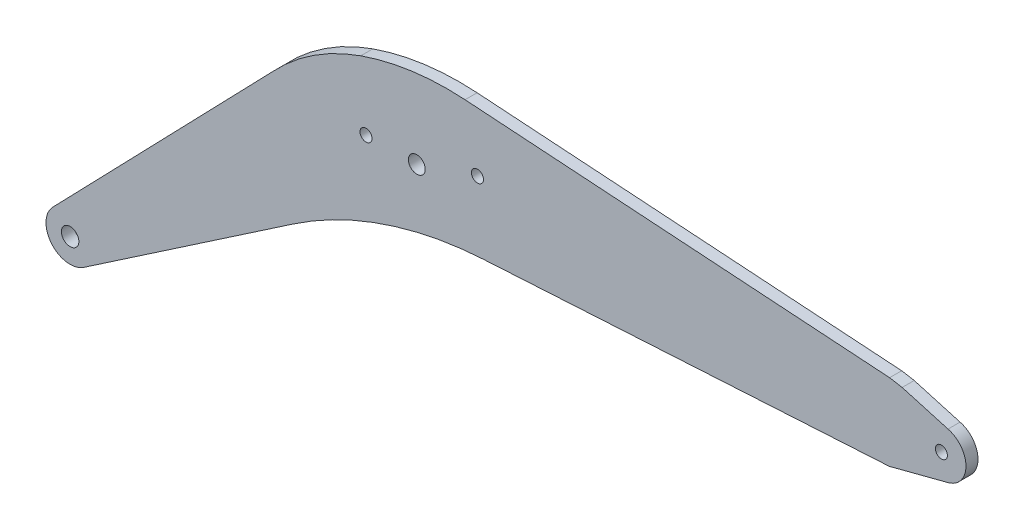
ISO-10303-21;
HEADER;
FILE_DESCRIPTION(('STEP AP214'),'2;1');
FILE_NAME('part.step','',(''),(''),'','','');
FILE_SCHEMA(('AUTOMOTIVE_DESIGN { 1 0 10303 214 1 1 1 1 }'));
ENDSEC;
DATA;
#1=APPLICATION_CONTEXT('core data for automotive mechanical design processes');
#2=APPLICATION_PROTOCOL_DEFINITION('international standard','automotive_design',2000,#1);
#3=PRODUCT_CONTEXT('',#1,'mechanical');
#4=PRODUCT('Part','Part','',(#3));
#5=PRODUCT_RELATED_PRODUCT_CATEGORY('part','',(#4));
#6=PRODUCT_DEFINITION_FORMATION('','',#4);
#7=PRODUCT_DEFINITION_CONTEXT('part definition',#1,'design');
#8=PRODUCT_DEFINITION('design','',#6,#7);
#9=PRODUCT_DEFINITION_SHAPE('','',#8);
#10=(LENGTH_UNIT() NAMED_UNIT(*) SI_UNIT(.MILLI.,.METRE.));
#11=(NAMED_UNIT(*) PLANE_ANGLE_UNIT() SI_UNIT($,.RADIAN.));
#12=(NAMED_UNIT(*) SI_UNIT($,.STERADIAN.) SOLID_ANGLE_UNIT());
#13=UNCERTAINTY_MEASURE_WITH_UNIT(LENGTH_MEASURE(1.E-05),#10,'distance_accuracy_value','');
#14=(GEOMETRIC_REPRESENTATION_CONTEXT(3) GLOBAL_UNCERTAINTY_ASSIGNED_CONTEXT((#13)) GLOBAL_UNIT_ASSIGNED_CONTEXT((#10,
#11,#12)) REPRESENTATION_CONTEXT('',''));
#15=CARTESIAN_POINT('',(0.,0.,0.));
#16=DIRECTION('',(0.,0.,1.));
#17=DIRECTION('',(1.,0.,0.));
#18=AXIS2_PLACEMENT_3D('',#15,#16,#17);
#19=CARTESIAN_POINT('',(-131.545238804572,15.2564723501261,3.));
#20=DIRECTION('',(0.,0.,1.));
#21=DIRECTION('',(1.,0.,0.));
#22=AXIS2_PLACEMENT_3D('',#19,#20,#21);
#23=PLANE('',#22);
#24=CARTESIAN_POINT('',(-57.9271369786803,73.9111813109327,3.));
#25=DIRECTION('',(0.,0.,1.));
#26=DIRECTION('',(1.,0.,0.));
#27=AXIS2_PLACEMENT_3D('',#24,#25,#26);
#28=CIRCLE('',#27,1.5);
#29=CARTESIAN_POINT('',(-56.4271369786803,73.9111813109327,3.));
#30=VERTEX_POINT('',#29);
#31=EDGE_CURVE('E301',#30,#30,#28,.T.);
#32=ORIENTED_EDGE('',*,*,#31,.F.);
#33=EDGE_LOOP('',(#32));
#34=FACE_BOUND('',#33,.T.);
#35=CARTESIAN_POINT('',(-131.545238804572,15.2564723501261,3.));
#36=DIRECTION('',(0.,0.,1.));
#37=DIRECTION('',(1.,0.,0.));
#38=AXIS2_PLACEMENT_3D('',#35,#36,#37);
#39=CIRCLE('',#38,2.175);
#40=CARTESIAN_POINT('',(-129.370238804572,15.2564723501261,3.));
#41=VERTEX_POINT('',#40);
#42=EDGE_CURVE('E314',#41,#41,#39,.T.);
#43=ORIENTED_EDGE('',*,*,#42,.F.);
#44=EDGE_LOOP('',(#43));
#45=FACE_BOUND('',#44,.T.);
#46=CARTESIAN_POINT('',(-131.545238804572,15.2564723501261,3.));
#47=DIRECTION('',(0.,0.,1.));
#48=DIRECTION('',(1.,0.,0.));
#49=AXIS2_PLACEMENT_3D('',#46,#47,#48);
#50=CIRCLE('',#49,6.00000000000002);
#51=CARTESIAN_POINT('',(-135.858404880973,19.4273953172143,3.));
#52=VERTEX_POINT('',#51);
#53=CARTESIAN_POINT('',(-128.173606682712,10.2933990245699,3.));
#54=VERTEX_POINT('',#53);
#55=EDGE_CURVE('E181',#52,#54,#50,.T.);
#56=ORIENTED_EDGE('',*,*,#55,.T.);
#57=DIRECTION('',(0.827178887592696,0.561938686976534,0.));
#58=VECTOR('',#57,1.);
#59=CARTESIAN_POINT('',(-128.173606682712,10.2933990245699,3.));
#60=LINE('',#59,#58);
#61=CARTESIAN_POINT('',(-76.0452388045716,45.7064723501261,3.));
#62=VERTEX_POINT('',#61);
#63=EDGE_CURVE('E112',#54,#62,#60,.T.);
#64=ORIENTED_EDGE('',*,*,#63,.T.);
#65=CARTESIAN_POINT('',(-23.341668011505,-31.873665965911,3.));
#66=DIRECTION('',(0.,0.,-1.));
#67=DIRECTION('',(-1.,0.,0.));
#68=AXIS2_PLACEMENT_3D('',#65,#66,#67);
#69=CIRCLE('',#68,93.7888278819776);
#70=CARTESIAN_POINT('',(-28.7952388045717,61.7564723501261,3.));
#71=VERTEX_POINT('',#70);
#72=EDGE_CURVE('E208',#62,#71,#69,.T.);
#73=ORIENTED_EDGE('',*,*,#72,.T.);
#74=DIRECTION('',(0.998308012057255,0.0581473392537677,0.));
#75=VECTOR('',#74,1.);
#76=CARTESIAN_POINT('',(-28.7952388045717,61.7564723501261,3.));
#77=LINE('',#76,#75);
#78=CARTESIAN_POINT('',(72.2571826827686,67.6423606367785,3.));
#79=VERTEX_POINT('',#78);
#80=EDGE_CURVE('E229',#71,#79,#77,.T.);
#81=ORIENTED_EDGE('',*,*,#80,.T.);
#82=DIRECTION('',(0.967821760115837,0.251636723564514,0.));
#83=VECTOR('',#82,1.);
#84=CARTESIAN_POINT('',(72.2571826827686,67.6423606367785,3.));
#85=LINE('',#84,#83);
#86=CARTESIAN_POINT('',(86.8536152517564,71.4374793443294,3.));
#87=VERTEX_POINT('',#86);
#88=EDGE_CURVE('E227',#79,#87,#85,.T.);
#89=ORIENTED_EDGE('',*,*,#88,.T.);
#90=CARTESIAN_POINT('',(85.3536587948242,77.2064723501261,3.));
#91=DIRECTION('',(0.,0.,1.));
#92=DIRECTION('',(1.,0.,0.));
#93=AXIS2_PLACEMENT_3D('',#90,#91,#92);
#94=CIRCLE('',#93,5.96080109327794);
#95=CARTESIAN_POINT('',(86.8536152517564,82.9754653559228,3.));
#96=VERTEX_POINT('',#95);
#97=EDGE_CURVE('E228',#87,#96,#94,.T.);
#98=ORIENTED_EDGE('',*,*,#97,.T.);
#99=DIRECTION('',(-0.961498834299442,0.274809009388,0.));
#100=VECTOR('',#99,1.);
#101=CARTESIAN_POINT('',(86.8536152517564,82.9754653559228,3.));
#102=LINE('',#101,#100);
#103=CARTESIAN_POINT('',(75.443530199253,86.2366176927282,3.));
#104=VERTEX_POINT('',#103);
#105=EDGE_CURVE('E233',#96,#104,#102,.T.);
#106=ORIENTED_EDGE('',*,*,#105,.T.);
#107=DIRECTION('',(-0.985134231864256,0.171786335921171,0.));
#108=VECTOR('',#107,1.);
#109=CARTESIAN_POINT('',(75.443530199253,86.2366176927282,3.));
#110=LINE('',#109,#108);
#111=CARTESIAN_POINT('',(72.3240612596195,86.7805863437265,3.));
#112=VERTEX_POINT('',#111);
#113=EDGE_CURVE('E240',#104,#112,#110,.T.);
#114=ORIENTED_EDGE('',*,*,#113,.T.);
#115=DIRECTION('',(-0.997763411032669,0.0668444134124417,0.));
#116=VECTOR('',#115,1.);
#117=CARTESIAN_POINT('',(72.3240612596195,86.7805863437265,3.));
#118=LINE('',#117,#116);
#119=CARTESIAN_POINT('',(-33.2952388045717,93.8564723501261,3.));
#120=VERTEX_POINT('',#119);
#121=EDGE_CURVE('E145',#112,#120,#118,.T.);
#122=ORIENTED_EDGE('',*,*,#121,.T.);
#123=CARTESIAN_POINT('',(-37.6697013598195,28.5603846482576,3.));
#124=DIRECTION('',(0.,0.,1.));
#125=DIRECTION('',(1.,0.,0.));
#126=AXIS2_PLACEMENT_3D('',#123,#124,#125);
#127=CIRCLE('',#126,65.4424555760048);
#128=CARTESIAN_POINT('',(-59.2400023293627,90.3457964207844,3.));
#129=VERTEX_POINT('',#128);
#130=EDGE_CURVE('E138',#120,#129,#127,.T.);
#131=ORIENTED_EDGE('',*,*,#130,.T.);
#132=CARTESIAN_POINT('',(-41.3597511826686,39.1300678477543,3.));
#133=DIRECTION('',(0.,0.,1.));
#134=DIRECTION('',(1.,0.,0.));
#135=AXIS2_PLACEMENT_3D('',#132,#133,#134);
#136=CIRCLE('',#135,54.2471587673967);
#137=CARTESIAN_POINT('',(-81.1452388045716,76.0064723501261,3.));
#138=VERTEX_POINT('',#137);
#139=EDGE_CURVE('E137',#129,#138,#136,.T.);
#140=ORIENTED_EDGE('',*,*,#139,.T.);
#141=DIRECTION('',(-0.695153827848035,-0.718861012733494,0.));
#142=VECTOR('',#141,1.);
#143=CARTESIAN_POINT('',(-81.1452388045716,76.0064723501261,3.));
#144=LINE('',#143,#142);
#145=EDGE_CURVE('E57',#138,#52,#144,.T.);
#146=ORIENTED_EDGE('',*,*,#145,.T.);
#147=EDGE_LOOP('',(#56,#64,#73,#81,#89,#98,#106,#114,#122,#131,#140,#146));
#148=FACE_BOUND('',#147,.T.);
#149=CARTESIAN_POINT('',(85.2047611954284,77.2064723501261,3.));
#150=DIRECTION('',(0.,0.,1.));
#151=DIRECTION('',(1.,0.,0.));
#152=AXIS2_PLACEMENT_3D('',#149,#150,#151);
#153=CIRCLE('',#152,1.5);
#154=CARTESIAN_POINT('',(86.7047611954284,77.2064723501261,3.));
#155=VERTEX_POINT('',#154);
#156=EDGE_CURVE('E161',#155,#155,#153,.T.);
#157=ORIENTED_EDGE('',*,*,#156,.F.);
#158=EDGE_LOOP('',(#157));
#159=FACE_BOUND('',#158,.T.);
#160=CARTESIAN_POINT('',(-45.2952388045717,73.9111813109327,3.));
#161=DIRECTION('',(0.,0.,1.));
#162=DIRECTION('',(1.,0.,0.));
#163=AXIS2_PLACEMENT_3D('',#160,#161,#162);
#164=CIRCLE('',#163,2.1);
#165=CARTESIAN_POINT('',(-43.1952388045717,73.9111813109327,3.));
#166=VERTEX_POINT('',#165);
#167=EDGE_CURVE('E310',#166,#166,#164,.T.);
#168=ORIENTED_EDGE('',*,*,#167,.F.);
#169=EDGE_LOOP('',(#168));
#170=FACE_BOUND('',#169,.T.);
#171=CARTESIAN_POINT('',(-30.210957336747,78.946585735948,3.));
#172=DIRECTION('',(0.,0.,1.));
#173=DIRECTION('',(1.,0.,0.));
#174=AXIS2_PLACEMENT_3D('',#171,#172,#173);
#175=CIRCLE('',#174,1.5);
#176=CARTESIAN_POINT('',(-28.710957336747,78.946585735948,3.));
#177=VERTEX_POINT('',#176);
#178=EDGE_CURVE('E295',#177,#177,#175,.T.);
#179=ORIENTED_EDGE('',*,*,#178,.F.);
#180=EDGE_LOOP('',(#179));
#181=FACE_BOUND('',#180,.T.);
#182=ADVANCED_FACE('F39',(#34,#45,#148,#159,#170,#181),#23,.T.);
#183=CARTESIAN_POINT('',(-131.545238804572,15.2564723501261,0.));
#184=DIRECTION('',(0.,0.,1.));
#185=DIRECTION('',(1.,0.,0.));
#186=AXIS2_PLACEMENT_3D('',#183,#184,#185);
#187=PLANE('',#186);
#188=CARTESIAN_POINT('',(-131.545238804572,15.2564723501261,0.));
#189=DIRECTION('',(0.,0.,1.));
#190=DIRECTION('',(1.,0.,0.));
#191=AXIS2_PLACEMENT_3D('',#188,#189,#190);
#192=CIRCLE('',#191,6.00000000000002);
#193=CARTESIAN_POINT('',(-135.858404880973,19.4273953172143,0.));
#194=VERTEX_POINT('',#193);
#195=CARTESIAN_POINT('',(-128.173606682712,10.2933990245699,0.));
#196=VERTEX_POINT('',#195);
#197=EDGE_CURVE('E158',#194,#196,#192,.T.);
#198=ORIENTED_EDGE('',*,*,#197,.F.);
#199=DIRECTION('',(-0.695153827848035,-0.718861012733494,0.));
#200=VECTOR('',#199,1.);
#201=CARTESIAN_POINT('',(-81.1452388045716,76.0064723501261,0.));
#202=LINE('',#201,#200);
#203=CARTESIAN_POINT('',(-81.1452388045716,76.0064723501261,0.));
#204=VERTEX_POINT('',#203);
#205=EDGE_CURVE('E102',#204,#194,#202,.T.);
#206=ORIENTED_EDGE('',*,*,#205,.F.);
#207=CARTESIAN_POINT('',(-41.3597511826686,39.1300678477543,0.));
#208=DIRECTION('',(0.,0.,1.));
#209=DIRECTION('',(1.,0.,0.));
#210=AXIS2_PLACEMENT_3D('',#207,#208,#209);
#211=CIRCLE('',#210,54.2471587673967);
#212=CARTESIAN_POINT('',(-59.2400023293627,90.3457964207844,0.));
#213=VERTEX_POINT('',#212);
#214=EDGE_CURVE('E100',#213,#204,#211,.T.);
#215=ORIENTED_EDGE('',*,*,#214,.F.);
#216=CARTESIAN_POINT('',(-37.6697013598195,28.5603846482576,0.));
#217=DIRECTION('',(0.,0.,1.));
#218=DIRECTION('',(1.,0.,0.));
#219=AXIS2_PLACEMENT_3D('',#216,#217,#218);
#220=CIRCLE('',#219,65.4424555760048);
#221=CARTESIAN_POINT('',(-33.2952388045717,93.8564723501261,0.));
#222=VERTEX_POINT('',#221);
#223=EDGE_CURVE('E149',#222,#213,#220,.T.);
#224=ORIENTED_EDGE('',*,*,#223,.F.);
#225=DIRECTION('',(-0.997763411032669,0.0668444134124417,0.));
#226=VECTOR('',#225,1.);
#227=CARTESIAN_POINT('',(72.3240612596195,86.7805863437265,0.));
#228=LINE('',#227,#226);
#229=CARTESIAN_POINT('',(72.3240612596195,86.7805863437265,0.));
#230=VERTEX_POINT('',#229);
#231=EDGE_CURVE('E178',#230,#222,#228,.T.);
#232=ORIENTED_EDGE('',*,*,#231,.F.);
#233=DIRECTION('',(-0.985134231864256,0.171786335921171,0.));
#234=VECTOR('',#233,1.);
#235=CARTESIAN_POINT('',(75.443530199253,86.2366176927282,0.));
#236=LINE('',#235,#234);
#237=CARTESIAN_POINT('',(75.443530199253,86.2366176927282,0.));
#238=VERTEX_POINT('',#237);
#239=EDGE_CURVE('E177',#238,#230,#236,.T.);
#240=ORIENTED_EDGE('',*,*,#239,.F.);
#241=DIRECTION('',(-0.961498834299442,0.274809009388,0.));
#242=VECTOR('',#241,1.);
#243=CARTESIAN_POINT('',(86.8536152517564,82.9754653559228,0.));
#244=LINE('',#243,#242);
#245=CARTESIAN_POINT('',(86.8536152517564,82.9754653559228,0.));
#246=VERTEX_POINT('',#245);
#247=EDGE_CURVE('E174',#246,#238,#244,.T.);
#248=ORIENTED_EDGE('',*,*,#247,.F.);
#249=CARTESIAN_POINT('',(85.3536587948242,77.2064723501261,0.));
#250=DIRECTION('',(0.,0.,1.));
#251=DIRECTION('',(1.,0.,0.));
#252=AXIS2_PLACEMENT_3D('',#249,#250,#251);
#253=CIRCLE('',#252,5.96080109327794);
#254=CARTESIAN_POINT('',(86.8536152517564,71.4374793443294,0.));
#255=VERTEX_POINT('',#254);
#256=EDGE_CURVE('E175',#255,#246,#253,.T.);
#257=ORIENTED_EDGE('',*,*,#256,.F.);
#258=DIRECTION('',(0.967821760115837,0.251636723564514,0.));
#259=VECTOR('',#258,1.);
#260=CARTESIAN_POINT('',(72.2571826827686,67.6423606367785,0.));
#261=LINE('',#260,#259);
#262=CARTESIAN_POINT('',(72.2571826827686,67.6423606367785,0.));
#263=VERTEX_POINT('',#262);
#264=EDGE_CURVE('E169',#263,#255,#261,.T.);
#265=ORIENTED_EDGE('',*,*,#264,.F.);
#266=DIRECTION('',(0.998308012057255,0.0581473392537677,0.));
#267=VECTOR('',#266,1.);
#268=CARTESIAN_POINT('',(-28.7952388045717,61.7564723501261,0.));
#269=LINE('',#268,#267);
#270=CARTESIAN_POINT('',(-28.7952388045717,61.7564723501261,0.));
#271=VERTEX_POINT('',#270);
#272=EDGE_CURVE('E168',#271,#263,#269,.T.);
#273=ORIENTED_EDGE('',*,*,#272,.F.);
#274=CARTESIAN_POINT('',(-23.341668011505,-31.873665965911,0.));
#275=DIRECTION('',(0.,0.,-1.));
#276=DIRECTION('',(-1.,0.,0.));
#277=AXIS2_PLACEMENT_3D('',#274,#275,#276);
#278=CIRCLE('',#277,93.7888278819776);
#279=CARTESIAN_POINT('',(-76.0452388045716,45.7064723501261,0.));
#280=VERTEX_POINT('',#279);
#281=EDGE_CURVE('E166',#280,#271,#278,.T.);
#282=ORIENTED_EDGE('',*,*,#281,.F.);
#283=DIRECTION('',(0.827178887592696,0.561938686976534,0.));
#284=VECTOR('',#283,1.);
#285=CARTESIAN_POINT('',(-128.173606682712,10.2933990245699,0.));
#286=LINE('',#285,#284);
#287=EDGE_CURVE('E164',#196,#280,#286,.T.);
#288=ORIENTED_EDGE('',*,*,#287,.F.);
#289=EDGE_LOOP('',(#198,#206,#215,#224,#232,#240,#248,#257,#265,#273,#282,#288));
#290=FACE_BOUND('',#289,.T.);
#291=CARTESIAN_POINT('',(85.2047611954284,77.2064723501261,0.));
#292=DIRECTION('',(0.,0.,1.));
#293=DIRECTION('',(1.,0.,0.));
#294=AXIS2_PLACEMENT_3D('',#291,#292,#293);
#295=CIRCLE('',#294,1.5);
#296=CARTESIAN_POINT('',(86.7047611954284,77.2064723501261,0.));
#297=VERTEX_POINT('',#296);
#298=EDGE_CURVE('E316',#297,#297,#295,.T.);
#299=ORIENTED_EDGE('',*,*,#298,.T.);
#300=EDGE_LOOP('',(#299));
#301=FACE_BOUND('',#300,.T.);
#302=CARTESIAN_POINT('',(-131.545238804572,15.2564723501261,0.));
#303=DIRECTION('',(0.,0.,1.));
#304=DIRECTION('',(1.,0.,0.));
#305=AXIS2_PLACEMENT_3D('',#302,#303,#304);
#306=CIRCLE('',#305,2.175);
#307=CARTESIAN_POINT('',(-129.370238804572,15.2564723501261,0.));
#308=VERTEX_POINT('',#307);
#309=EDGE_CURVE('E308',#308,#308,#306,.T.);
#310=ORIENTED_EDGE('',*,*,#309,.T.);
#311=EDGE_LOOP('',(#310));
#312=FACE_BOUND('',#311,.T.);
#313=CARTESIAN_POINT('',(-45.2952388045717,73.9111813109327,0.));
#314=DIRECTION('',(0.,0.,1.));
#315=DIRECTION('',(1.,0.,0.));
#316=AXIS2_PLACEMENT_3D('',#313,#314,#315);
#317=CIRCLE('',#316,2.1);
#318=CARTESIAN_POINT('',(-43.1952388045717,73.9111813109327,0.));
#319=VERTEX_POINT('',#318);
#320=EDGE_CURVE('E303',#319,#319,#317,.T.);
#321=ORIENTED_EDGE('',*,*,#320,.T.);
#322=EDGE_LOOP('',(#321));
#323=FACE_BOUND('',#322,.T.);
#324=CARTESIAN_POINT('',(-57.9271369786803,73.9111813109327,0.));
#325=DIRECTION('',(0.,0.,1.));
#326=DIRECTION('',(1.,0.,0.));
#327=AXIS2_PLACEMENT_3D('',#324,#325,#326);
#328=CIRCLE('',#327,1.5);
#329=CARTESIAN_POINT('',(-56.4271369786803,73.9111813109327,0.));
#330=VERTEX_POINT('',#329);
#331=EDGE_CURVE('E298',#330,#330,#328,.T.);
#332=ORIENTED_EDGE('',*,*,#331,.T.);
#333=EDGE_LOOP('',(#332));
#334=FACE_BOUND('',#333,.T.);
#335=CARTESIAN_POINT('',(-30.210957336747,78.946585735948,0.));
#336=DIRECTION('',(0.,0.,1.));
#337=DIRECTION('',(1.,0.,0.));
#338=AXIS2_PLACEMENT_3D('',#335,#336,#337);
#339=CIRCLE('',#338,1.5);
#340=CARTESIAN_POINT('',(-28.710957336747,78.946585735948,0.));
#341=VERTEX_POINT('',#340);
#342=EDGE_CURVE('E294',#341,#341,#339,.T.);
#343=ORIENTED_EDGE('',*,*,#342,.T.);
#344=EDGE_LOOP('',(#343));
#345=FACE_BOUND('',#344,.T.);
#346=ADVANCED_FACE('F211',(#290,#301,#312,#323,#334,#345),#187,.F.);
#347=CARTESIAN_POINT('',(-131.545238804572,15.2564723501261,3.));
#348=DIRECTION('',(0.,0.,-1.));
#349=DIRECTION('',(-1.,0.,0.));
#350=AXIS2_PLACEMENT_3D('',#347,#348,#349);
#351=CYLINDRICAL_SURFACE('',#350,6.00000000000002);
#352=ORIENTED_EDGE('',*,*,#197,.T.);
#353=DIRECTION('',(0.,0.,-1.));
#354=VECTOR('',#353,1.);
#355=CARTESIAN_POINT('',(-128.173606682712,10.2933990245699,3.));
#356=LINE('',#355,#354);
#357=EDGE_CURVE('E11',#54,#196,#356,.T.);
#358=ORIENTED_EDGE('',*,*,#357,.F.);
#359=ORIENTED_EDGE('',*,*,#55,.F.);
#360=DIRECTION('',(0.,0.,-1.));
#361=VECTOR('',#360,1.);
#362=CARTESIAN_POINT('',(-135.858404880973,19.4273953172143,3.));
#363=LINE('',#362,#361);
#364=EDGE_CURVE('E157',#52,#194,#363,.T.);
#365=ORIENTED_EDGE('',*,*,#364,.T.);
#366=EDGE_LOOP('',(#352,#358,#359,#365));
#367=FACE_BOUND('',#366,.T.);
#368=ADVANCED_FACE('F41',(#367),#351,.T.);
#369=CARTESIAN_POINT('',(-128.173606682712,10.2933990245699,3.));
#370=DIRECTION('',(-0.561938686976533,0.827178887592696,0.));
#371=DIRECTION('',(-0.827178887592696,-0.561938686976534,0.));
#372=AXIS2_PLACEMENT_3D('',#369,#370,#371);
#373=PLANE('',#372);
#374=ORIENTED_EDGE('',*,*,#287,.T.);
#375=DIRECTION('',(0.,0.,-1.));
#376=VECTOR('',#375,1.);
#377=CARTESIAN_POINT('',(-76.0452388045716,45.7064723501261,3.));
#378=LINE('',#377,#376);
#379=EDGE_CURVE('E48',#62,#280,#378,.T.);
#380=ORIENTED_EDGE('',*,*,#379,.F.);
#381=ORIENTED_EDGE('',*,*,#63,.F.);
#382=ORIENTED_EDGE('',*,*,#357,.T.);
#383=EDGE_LOOP('',(#374,#380,#381,#382));
#384=FACE_BOUND('',#383,.T.);
#385=ADVANCED_FACE('F437',(#384),#373,.F.);
#386=CARTESIAN_POINT('',(-23.341668011505,-31.873665965911,3.));
#387=DIRECTION('',(0.,0.,-1.));
#388=DIRECTION('',(-1.,0.,0.));
#389=AXIS2_PLACEMENT_3D('',#386,#387,#388);
#390=CYLINDRICAL_SURFACE('',#389,93.7888278819776);
#391=ORIENTED_EDGE('',*,*,#281,.T.);
#392=DIRECTION('',(0.,0.,-1.));
#393=VECTOR('',#392,1.);
#394=CARTESIAN_POINT('',(-28.7952388045717,61.7564723501261,3.));
#395=LINE('',#394,#393);
#396=EDGE_CURVE('E205',#71,#271,#395,.T.);
#397=ORIENTED_EDGE('',*,*,#396,.F.);
#398=ORIENTED_EDGE('',*,*,#72,.F.);
#399=ORIENTED_EDGE('',*,*,#379,.T.);
#400=EDGE_LOOP('',(#391,#397,#398,#399));
#401=FACE_BOUND('',#400,.T.);
#402=ADVANCED_FACE('F209',(#401),#390,.F.);
#403=CARTESIAN_POINT('',(-28.7952388045717,61.7564723501261,3.));
#404=DIRECTION('',(-0.0581473392537677,0.998308012057254,0.));
#405=DIRECTION('',(-0.998308012057255,-0.0581473392537677,0.));
#406=AXIS2_PLACEMENT_3D('',#403,#404,#405);
#407=PLANE('',#406);
#408=ORIENTED_EDGE('',*,*,#272,.T.);
#409=DIRECTION('',(0.,0.,-1.));
#410=VECTOR('',#409,1.);
#411=CARTESIAN_POINT('',(72.2571826827686,67.6423606367785,3.));
#412=LINE('',#411,#410);
#413=EDGE_CURVE('E197',#79,#263,#412,.T.);
#414=ORIENTED_EDGE('',*,*,#413,.F.);
#415=ORIENTED_EDGE('',*,*,#80,.F.);
#416=ORIENTED_EDGE('',*,*,#396,.T.);
#417=EDGE_LOOP('',(#408,#414,#415,#416));
#418=FACE_BOUND('',#417,.T.);
#419=ADVANCED_FACE('F219',(#418),#407,.F.);
#420=CARTESIAN_POINT('',(72.2571826827686,67.6423606367785,3.));
#421=DIRECTION('',(-0.251636723564514,0.967821760115837,0.));
#422=DIRECTION('',(-0.967821760115837,-0.251636723564514,0.));
#423=AXIS2_PLACEMENT_3D('',#420,#421,#422);
#424=PLANE('',#423);
#425=ORIENTED_EDGE('',*,*,#264,.T.);
#426=DIRECTION('',(0.,0.,-1.));
#427=VECTOR('',#426,1.);
#428=CARTESIAN_POINT('',(86.8536152517564,71.4374793443294,3.));
#429=LINE('',#428,#427);
#430=EDGE_CURVE('E196',#87,#255,#429,.T.);
#431=ORIENTED_EDGE('',*,*,#430,.F.);
#432=ORIENTED_EDGE('',*,*,#88,.F.);
#433=ORIENTED_EDGE('',*,*,#413,.T.);
#434=EDGE_LOOP('',(#425,#431,#432,#433));
#435=FACE_BOUND('',#434,.T.);
#436=ADVANCED_FACE('F224',(#435),#424,.F.);
#437=CARTESIAN_POINT('',(85.3536587948242,77.2064723501261,3.));
#438=DIRECTION('',(0.,0.,-1.));
#439=DIRECTION('',(-1.,0.,0.));
#440=AXIS2_PLACEMENT_3D('',#437,#438,#439);
#441=CYLINDRICAL_SURFACE('',#440,5.96080109327794);
#442=ORIENTED_EDGE('',*,*,#256,.T.);
#443=DIRECTION('',(0.,0.,-1.));
#444=VECTOR('',#443,1.);
#445=CARTESIAN_POINT('',(86.8536152517564,82.9754653559228,3.));
#446=LINE('',#445,#444);
#447=EDGE_CURVE('E193',#96,#246,#446,.T.);
#448=ORIENTED_EDGE('',*,*,#447,.F.);
#449=ORIENTED_EDGE('',*,*,#97,.F.);
#450=ORIENTED_EDGE('',*,*,#430,.T.);
#451=EDGE_LOOP('',(#442,#448,#449,#450));
#452=FACE_BOUND('',#451,.T.);
#453=ADVANCED_FACE('F404',(#452),#441,.T.);
#454=CARTESIAN_POINT('',(86.8536152517564,82.9754653559228,3.));
#455=DIRECTION('',(-0.274809009388,-0.961498834299442,0.));
#456=DIRECTION('',(0.961498834299442,-0.274809009388,0.));
#457=AXIS2_PLACEMENT_3D('',#454,#455,#456);
#458=PLANE('',#457);
#459=ORIENTED_EDGE('',*,*,#247,.T.);
#460=DIRECTION('',(0.,0.,-1.));
#461=VECTOR('',#460,1.);
#462=CARTESIAN_POINT('',(75.443530199253,86.2366176927282,3.));
#463=LINE('',#462,#461);
#464=EDGE_CURVE('E187',#104,#238,#463,.T.);
#465=ORIENTED_EDGE('',*,*,#464,.F.);
#466=ORIENTED_EDGE('',*,*,#105,.F.);
#467=ORIENTED_EDGE('',*,*,#447,.T.);
#468=EDGE_LOOP('',(#459,#465,#466,#467));
#469=FACE_BOUND('',#468,.T.);
#470=ADVANCED_FACE('F396',(#469),#458,.F.);
#471=CARTESIAN_POINT('',(75.443530199253,86.2366176927282,3.));
#472=DIRECTION('',(-0.171786335921171,-0.985134231864256,0.));
#473=DIRECTION('',(0.985134231864256,-0.171786335921171,0.));
#474=AXIS2_PLACEMENT_3D('',#471,#472,#473);
#475=PLANE('',#474);
#476=ORIENTED_EDGE('',*,*,#239,.T.);
#477=DIRECTION('',(0.,0.,-1.));
#478=VECTOR('',#477,1.);
#479=CARTESIAN_POINT('',(72.3240612596195,86.7805863437265,3.));
#480=LINE('',#479,#478);
#481=EDGE_CURVE('E190',#112,#230,#480,.T.);
#482=ORIENTED_EDGE('',*,*,#481,.F.);
#483=ORIENTED_EDGE('',*,*,#113,.F.);
#484=ORIENTED_EDGE('',*,*,#464,.T.);
#485=EDGE_LOOP('',(#476,#482,#483,#484));
#486=FACE_BOUND('',#485,.T.);
#487=ADVANCED_FACE('F243',(#486),#475,.F.);
#488=CARTESIAN_POINT('',(72.3240612596195,86.7805863437265,3.));
#489=DIRECTION('',(-0.0668444134124417,-0.997763411032669,0.));
#490=DIRECTION('',(0.997763411032669,-0.0668444134124417,0.));
#491=AXIS2_PLACEMENT_3D('',#488,#489,#490);
#492=PLANE('',#491);
#493=ORIENTED_EDGE('',*,*,#231,.T.);
#494=DIRECTION('',(0.,0.,-1.));
#495=VECTOR('',#494,1.);
#496=CARTESIAN_POINT('',(-33.2952388045717,93.8564723501261,3.));
#497=LINE('',#496,#495);
#498=EDGE_CURVE('E151',#120,#222,#497,.T.);
#499=ORIENTED_EDGE('',*,*,#498,.F.);
#500=ORIENTED_EDGE('',*,*,#121,.F.);
#501=ORIENTED_EDGE('',*,*,#481,.T.);
#502=EDGE_LOOP('',(#493,#499,#500,#501));
#503=FACE_BOUND('',#502,.T.);
#504=ADVANCED_FACE('F250',(#503),#492,.F.);
#505=CARTESIAN_POINT('',(-37.6697013598195,28.5603846482576,3.));
#506=DIRECTION('',(0.,0.,-1.));
#507=DIRECTION('',(-1.,0.,0.));
#508=AXIS2_PLACEMENT_3D('',#505,#506,#507);
#509=CYLINDRICAL_SURFACE('',#508,65.4424555760048);
#510=ORIENTED_EDGE('',*,*,#223,.T.);
#511=DIRECTION('',(0.,0.,-1.));
#512=VECTOR('',#511,1.);
#513=CARTESIAN_POINT('',(-59.2400023293627,90.3457964207844,3.));
#514=LINE('',#513,#512);
#515=EDGE_CURVE('E150',#129,#213,#514,.T.);
#516=ORIENTED_EDGE('',*,*,#515,.F.);
#517=ORIENTED_EDGE('',*,*,#130,.F.);
#518=ORIENTED_EDGE('',*,*,#498,.T.);
#519=EDGE_LOOP('',(#510,#516,#517,#518));
#520=FACE_BOUND('',#519,.T.);
#521=ADVANCED_FACE('F148',(#520),#509,.T.);
#522=CARTESIAN_POINT('',(-41.3597511826686,39.1300678477543,3.));
#523=DIRECTION('',(0.,0.,-1.));
#524=DIRECTION('',(-1.,0.,0.));
#525=AXIS2_PLACEMENT_3D('',#522,#523,#524);
#526=CYLINDRICAL_SURFACE('',#525,54.2471587673967);
#527=ORIENTED_EDGE('',*,*,#214,.T.);
#528=DIRECTION('',(0.,0.,-1.));
#529=VECTOR('',#528,1.);
#530=CARTESIAN_POINT('',(-81.1452388045716,76.0064723501261,3.));
#531=LINE('',#530,#529);
#532=EDGE_CURVE('E155',#138,#204,#531,.T.);
#533=ORIENTED_EDGE('',*,*,#532,.F.);
#534=ORIENTED_EDGE('',*,*,#139,.F.);
#535=ORIENTED_EDGE('',*,*,#515,.T.);
#536=EDGE_LOOP('',(#527,#533,#534,#535));
#537=FACE_BOUND('',#536,.T.);
#538=ADVANCED_FACE('F153',(#537),#526,.T.);
#539=CARTESIAN_POINT('',(-81.1452388045716,76.0064723501261,3.));
#540=DIRECTION('',(0.718861012733494,-0.695153827848035,0.));
#541=DIRECTION('',(0.695153827848035,0.718861012733494,0.));
#542=AXIS2_PLACEMENT_3D('',#539,#540,#541);
#543=PLANE('',#542);
#544=ORIENTED_EDGE('',*,*,#205,.T.);
#545=ORIENTED_EDGE('',*,*,#364,.F.);
#546=ORIENTED_EDGE('',*,*,#145,.F.);
#547=ORIENTED_EDGE('',*,*,#532,.T.);
#548=EDGE_LOOP('',(#544,#545,#546,#547));
#549=FACE_BOUND('',#548,.T.);
#550=ADVANCED_FACE('F251',(#549),#543,.F.);
#551=CARTESIAN_POINT('',(85.2047611954284,77.2064723501261,3.));
#552=DIRECTION('',(0.,0.,-1.));
#553=DIRECTION('',(-1.,0.,0.));
#554=AXIS2_PLACEMENT_3D('',#551,#552,#553);
#555=CYLINDRICAL_SURFACE('',#554,1.5);
#556=ORIENTED_EDGE('',*,*,#156,.T.);
#557=EDGE_LOOP('',(#556));
#558=FACE_BOUND('',#557,.T.);
#559=ORIENTED_EDGE('',*,*,#298,.F.);
#560=EDGE_LOOP('',(#559));
#561=FACE_BOUND('',#560,.T.);
#562=ADVANCED_FACE('F252',(#558,#561),#555,.F.);
#563=CARTESIAN_POINT('',(-131.545238804572,15.2564723501261,3.));
#564=DIRECTION('',(0.,0.,-1.));
#565=DIRECTION('',(-1.,0.,0.));
#566=AXIS2_PLACEMENT_3D('',#563,#564,#565);
#567=CYLINDRICAL_SURFACE('',#566,2.175);
#568=ORIENTED_EDGE('',*,*,#42,.T.);
#569=EDGE_LOOP('',(#568));
#570=FACE_BOUND('',#569,.T.);
#571=ORIENTED_EDGE('',*,*,#309,.F.);
#572=EDGE_LOOP('',(#571));
#573=FACE_BOUND('',#572,.T.);
#574=ADVANCED_FACE('F256',(#570,#573),#567,.F.);
#575=CARTESIAN_POINT('',(-45.2952388045717,73.9111813109327,3.));
#576=DIRECTION('',(0.,0.,-1.));
#577=DIRECTION('',(-1.,0.,0.));
#578=AXIS2_PLACEMENT_3D('',#575,#576,#577);
#579=CYLINDRICAL_SURFACE('',#578,2.1);
#580=ORIENTED_EDGE('',*,*,#167,.T.);
#581=EDGE_LOOP('',(#580));
#582=FACE_BOUND('',#581,.T.);
#583=ORIENTED_EDGE('',*,*,#320,.F.);
#584=EDGE_LOOP('',(#583));
#585=FACE_BOUND('',#584,.T.);
#586=ADVANCED_FACE('F273',(#582,#585),#579,.F.);
#587=CARTESIAN_POINT('',(-57.9271369786803,73.9111813109327,3.));
#588=DIRECTION('',(0.,0.,-1.));
#589=DIRECTION('',(-1.,0.,0.));
#590=AXIS2_PLACEMENT_3D('',#587,#588,#589);
#591=CYLINDRICAL_SURFACE('',#590,1.5);
#592=ORIENTED_EDGE('',*,*,#31,.T.);
#593=EDGE_LOOP('',(#592));
#594=FACE_BOUND('',#593,.T.);
#595=ORIENTED_EDGE('',*,*,#331,.F.);
#596=EDGE_LOOP('',(#595));
#597=FACE_BOUND('',#596,.T.);
#598=ADVANCED_FACE('F279',(#594,#597),#591,.F.);
#599=CARTESIAN_POINT('',(-30.210957336747,78.946585735948,3.));
#600=DIRECTION('',(0.,0.,-1.));
#601=DIRECTION('',(-1.,0.,0.));
#602=AXIS2_PLACEMENT_3D('',#599,#600,#601);
#603=CYLINDRICAL_SURFACE('',#602,1.5);
#604=ORIENTED_EDGE('',*,*,#178,.T.);
#605=EDGE_LOOP('',(#604));
#606=FACE_BOUND('',#605,.T.);
#607=ORIENTED_EDGE('',*,*,#342,.F.);
#608=EDGE_LOOP('',(#607));
#609=FACE_BOUND('',#608,.T.);
#610=ADVANCED_FACE('F281',(#606,#609),#603,.F.);
#611=CLOSED_SHELL('',(#182,#346,#368,#385,#402,#419,#436,#453,#470,#487,#504,#521,#538,#550,
#562,#574,#586,#598,#610));
#612=MANIFOLD_SOLID_BREP('B2',#611);
#613=ADVANCED_BREP_SHAPE_REPRESENTATION('',(#18,#612),#14);
#614=SHAPE_DEFINITION_REPRESENTATION(#9,#613);
ENDSEC;
END-ISO-10303-21;
